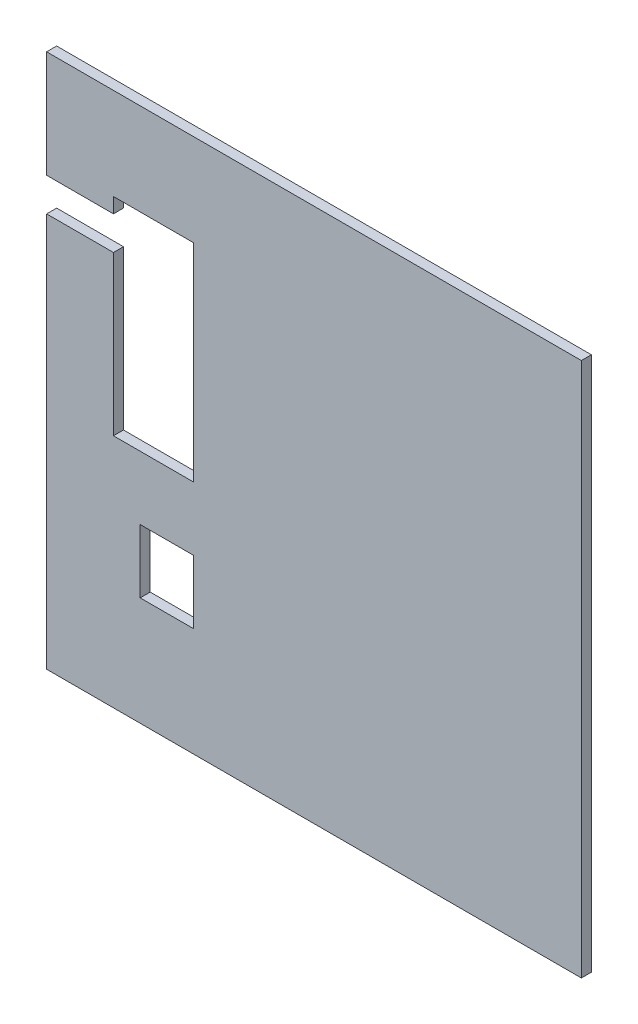
ISO-10303-21;
HEADER;
FILE_DESCRIPTION(('STEP AP214'),'2;1');
FILE_NAME('part.step','',(''),(''),'','','');
FILE_SCHEMA(('AUTOMOTIVE_DESIGN { 1 0 10303 214 1 1 1 1 }'));
ENDSEC;
DATA;
#1=APPLICATION_CONTEXT('core data for automotive mechanical design processes');
#2=APPLICATION_PROTOCOL_DEFINITION('international standard','automotive_design',2000,#1);
#3=PRODUCT_CONTEXT('',#1,'mechanical');
#4=PRODUCT('Part','Part','',(#3));
#5=PRODUCT_RELATED_PRODUCT_CATEGORY('part','',(#4));
#6=PRODUCT_DEFINITION_FORMATION('','',#4);
#7=PRODUCT_DEFINITION_CONTEXT('part definition',#1,'design');
#8=PRODUCT_DEFINITION('design','',#6,#7);
#9=PRODUCT_DEFINITION_SHAPE('','',#8);
#10=(LENGTH_UNIT() NAMED_UNIT(*) SI_UNIT(.MILLI.,.METRE.));
#11=(NAMED_UNIT(*) PLANE_ANGLE_UNIT() SI_UNIT($,.RADIAN.));
#12=(NAMED_UNIT(*) SI_UNIT($,.STERADIAN.) SOLID_ANGLE_UNIT());
#13=UNCERTAINTY_MEASURE_WITH_UNIT(LENGTH_MEASURE(1.E-05),#10,'distance_accuracy_value','');
#14=(GEOMETRIC_REPRESENTATION_CONTEXT(3) GLOBAL_UNCERTAINTY_ASSIGNED_CONTEXT((#13)) GLOBAL_UNIT_ASSIGNED_CONTEXT((#10,
#11,#12)) REPRESENTATION_CONTEXT('',''));
#15=CARTESIAN_POINT('',(0.,0.,0.));
#16=DIRECTION('',(0.,0.,1.));
#17=DIRECTION('',(1.,0.,0.));
#18=AXIS2_PLACEMENT_3D('',#15,#16,#17);
#19=CARTESIAN_POINT('',(0.,0.,3.));
#20=DIRECTION('',(0.,0.,1.));
#21=DIRECTION('',(1.,0.,0.));
#22=AXIS2_PLACEMENT_3D('',#19,#20,#21);
#23=PLANE('',#22);
#24=DIRECTION('',(0.,-1.,0.));
#25=VECTOR('',#24,1.);
#26=CARTESIAN_POINT('',(-80.,48.,3.));
#27=LINE('',#26,#25);
#28=CARTESIAN_POINT('',(-80.,80.,3.));
#29=VERTEX_POINT('',#28);
#30=CARTESIAN_POINT('',(-80.,48.,3.));
#31=VERTEX_POINT('',#30);
#32=EDGE_CURVE('E182',#29,#31,#27,.T.);
#33=ORIENTED_EDGE('',*,*,#32,.T.);
#34=DIRECTION('',(1.,0.,0.));
#35=VECTOR('',#34,1.);
#36=CARTESIAN_POINT('',(-80.,48.,3.));
#37=LINE('',#36,#35);
#38=CARTESIAN_POINT('',(-60.,48.,3.));
#39=VERTEX_POINT('',#38);
#40=EDGE_CURVE('E185',#31,#39,#37,.T.);
#41=ORIENTED_EDGE('',*,*,#40,.T.);
#42=DIRECTION('',(0.,1.,0.));
#43=VECTOR('',#42,1.);
#44=CARTESIAN_POINT('',(-60.,48.,3.));
#45=LINE('',#44,#43);
#46=CARTESIAN_POINT('',(-60.,52.5,3.));
#47=VERTEX_POINT('',#46);
#48=EDGE_CURVE('E188',#39,#47,#45,.T.);
#49=ORIENTED_EDGE('',*,*,#48,.T.);
#50=DIRECTION('',(1.,0.,0.));
#51=VECTOR('',#50,1.);
#52=CARTESIAN_POINT('',(-60.,52.5,3.));
#53=LINE('',#52,#51);
#54=CARTESIAN_POINT('',(-36.,52.5,3.));
#55=VERTEX_POINT('',#54);
#56=EDGE_CURVE('E190',#47,#55,#53,.T.);
#57=ORIENTED_EDGE('',*,*,#56,.T.);
#58=DIRECTION('',(0.,-1.,0.));
#59=VECTOR('',#58,1.);
#60=CARTESIAN_POINT('',(-36.,52.5,3.));
#61=LINE('',#60,#59);
#62=CARTESIAN_POINT('',(-36.,-9.49999999999999,3.));
#63=VERTEX_POINT('',#62);
#64=EDGE_CURVE('E192',#55,#63,#61,.T.);
#65=ORIENTED_EDGE('',*,*,#64,.T.);
#66=DIRECTION('',(-1.,0.,0.));
#67=VECTOR('',#66,1.);
#68=CARTESIAN_POINT('',(-36.,-9.49999999999999,3.));
#69=LINE('',#68,#67);
#70=CARTESIAN_POINT('',(-60.,-9.49999999999999,3.));
#71=VERTEX_POINT('',#70);
#72=EDGE_CURVE('E194',#63,#71,#69,.T.);
#73=ORIENTED_EDGE('',*,*,#72,.T.);
#74=DIRECTION('',(0.,1.,0.));
#75=VECTOR('',#74,1.);
#76=CARTESIAN_POINT('',(-60.,-9.49999999999999,3.));
#77=LINE('',#76,#75);
#78=CARTESIAN_POINT('',(-60.,38.,3.));
#79=VERTEX_POINT('',#78);
#80=EDGE_CURVE('E196',#71,#79,#77,.T.);
#81=ORIENTED_EDGE('',*,*,#80,.T.);
#82=DIRECTION('',(-1.,0.,0.));
#83=VECTOR('',#82,1.);
#84=CARTESIAN_POINT('',(-60.,38.,3.));
#85=LINE('',#84,#83);
#86=CARTESIAN_POINT('',(-80.,38.,3.));
#87=VERTEX_POINT('',#86);
#88=EDGE_CURVE('E198',#79,#87,#85,.T.);
#89=ORIENTED_EDGE('',*,*,#88,.T.);
#90=DIRECTION('',(0.,-1.,0.));
#91=VECTOR('',#90,1.);
#92=CARTESIAN_POINT('',(-80.,-80.,3.));
#93=LINE('',#92,#91);
#94=CARTESIAN_POINT('',(-80.,-80.,3.));
#95=VERTEX_POINT('',#94);
#96=EDGE_CURVE('E200',#87,#95,#93,.T.);
#97=ORIENTED_EDGE('',*,*,#96,.T.);
#98=DIRECTION('',(1.,0.,0.));
#99=VECTOR('',#98,1.);
#100=CARTESIAN_POINT('',(80.,-80.,3.));
#101=LINE('',#100,#99);
#102=CARTESIAN_POINT('',(80.,-80.,3.));
#103=VERTEX_POINT('',#102);
#104=EDGE_CURVE('E202',#95,#103,#101,.T.);
#105=ORIENTED_EDGE('',*,*,#104,.T.);
#106=DIRECTION('',(0.,1.,0.));
#107=VECTOR('',#106,1.);
#108=CARTESIAN_POINT('',(80.,-80.,3.));
#109=LINE('',#108,#107);
#110=CARTESIAN_POINT('',(80.,80.,3.));
#111=VERTEX_POINT('',#110);
#112=EDGE_CURVE('E204',#103,#111,#109,.T.);
#113=ORIENTED_EDGE('',*,*,#112,.T.);
#114=DIRECTION('',(-1.,0.,0.));
#115=VECTOR('',#114,1.);
#116=CARTESIAN_POINT('',(80.,80.,3.));
#117=LINE('',#116,#115);
#118=EDGE_CURVE('E206',#111,#29,#117,.T.);
#119=ORIENTED_EDGE('',*,*,#118,.T.);
#120=EDGE_LOOP('',(#33,#41,#49,#57,#65,#73,#81,#89,#97,#105,#113,#119));
#121=FACE_BOUND('',#120,.T.);
#122=DIRECTION('',(1.,0.,0.));
#123=VECTOR('',#122,1.);
#124=CARTESIAN_POINT('',(-52.,-47.5,3.));
#125=LINE('',#124,#123);
#126=CARTESIAN_POINT('',(-52.,-47.5,3.));
#127=VERTEX_POINT('',#126);
#128=CARTESIAN_POINT('',(-36.,-47.5,3.));
#129=VERTEX_POINT('',#128);
#130=EDGE_CURVE('E154',#127,#129,#125,.T.);
#131=ORIENTED_EDGE('',*,*,#130,.F.);
#132=DIRECTION('',(0.,-1.,0.));
#133=VECTOR('',#132,1.);
#134=CARTESIAN_POINT('',(-52.,-28.5,3.));
#135=LINE('',#134,#133);
#136=CARTESIAN_POINT('',(-52.,-28.5,3.));
#137=VERTEX_POINT('',#136);
#138=EDGE_CURVE('E146',#137,#127,#135,.T.);
#139=ORIENTED_EDGE('',*,*,#138,.F.);
#140=DIRECTION('',(-1.,0.,0.));
#141=VECTOR('',#140,1.);
#142=CARTESIAN_POINT('',(-52.,-28.5,3.));
#143=LINE('',#142,#141);
#144=CARTESIAN_POINT('',(-36.,-28.5,3.));
#145=VERTEX_POINT('',#144);
#146=EDGE_CURVE('E168',#145,#137,#143,.T.);
#147=ORIENTED_EDGE('',*,*,#146,.F.);
#148=DIRECTION('',(0.,1.,0.));
#149=VECTOR('',#148,1.);
#150=CARTESIAN_POINT('',(-36.,-28.5,3.));
#151=LINE('',#150,#149);
#152=EDGE_CURVE('E166',#129,#145,#151,.T.);
#153=ORIENTED_EDGE('',*,*,#152,.F.);
#154=EDGE_LOOP('',(#131,#139,#147,#153));
#155=FACE_BOUND('',#154,.T.);
#156=ADVANCED_FACE('F33',(#121,#155),#23,.T.);
#157=CARTESIAN_POINT('',(0.,0.,0.));
#158=DIRECTION('',(0.,0.,1.));
#159=DIRECTION('',(1.,0.,0.));
#160=AXIS2_PLACEMENT_3D('',#157,#158,#159);
#161=PLANE('',#160);
#162=DIRECTION('',(0.,-1.,0.));
#163=VECTOR('',#162,1.);
#164=CARTESIAN_POINT('',(-80.,48.,0.));
#165=LINE('',#164,#163);
#166=CARTESIAN_POINT('',(-80.,80.,0.));
#167=VERTEX_POINT('',#166);
#168=CARTESIAN_POINT('',(-80.,48.,0.));
#169=VERTEX_POINT('',#168);
#170=EDGE_CURVE('E162',#167,#169,#165,.T.);
#171=ORIENTED_EDGE('',*,*,#170,.F.);
#172=DIRECTION('',(-1.,0.,0.));
#173=VECTOR('',#172,1.);
#174=CARTESIAN_POINT('',(80.,80.,0.));
#175=LINE('',#174,#173);
#176=CARTESIAN_POINT('',(80.,80.,0.));
#177=VERTEX_POINT('',#176);
#178=EDGE_CURVE('E186',#177,#167,#175,.T.);
#179=ORIENTED_EDGE('',*,*,#178,.F.);
#180=DIRECTION('',(0.,1.,0.));
#181=VECTOR('',#180,1.);
#182=CARTESIAN_POINT('',(80.,-80.,0.));
#183=LINE('',#182,#181);
#184=CARTESIAN_POINT('',(80.,-80.,0.));
#185=VERTEX_POINT('',#184);
#186=EDGE_CURVE('E229',#185,#177,#183,.T.);
#187=ORIENTED_EDGE('',*,*,#186,.F.);
#188=DIRECTION('',(1.,0.,0.));
#189=VECTOR('',#188,1.);
#190=CARTESIAN_POINT('',(80.,-80.,0.));
#191=LINE('',#190,#189);
#192=CARTESIAN_POINT('',(-80.,-80.,0.));
#193=VERTEX_POINT('',#192);
#194=EDGE_CURVE('E227',#193,#185,#191,.T.);
#195=ORIENTED_EDGE('',*,*,#194,.F.);
#196=DIRECTION('',(0.,-1.,0.));
#197=VECTOR('',#196,1.);
#198=CARTESIAN_POINT('',(-80.,-80.,0.));
#199=LINE('',#198,#197);
#200=CARTESIAN_POINT('',(-80.,38.,0.));
#201=VERTEX_POINT('',#200);
#202=EDGE_CURVE('E225',#201,#193,#199,.T.);
#203=ORIENTED_EDGE('',*,*,#202,.F.);
#204=DIRECTION('',(-1.,0.,0.));
#205=VECTOR('',#204,1.);
#206=CARTESIAN_POINT('',(-60.,38.,0.));
#207=LINE('',#206,#205);
#208=CARTESIAN_POINT('',(-60.,38.,0.));
#209=VERTEX_POINT('',#208);
#210=EDGE_CURVE('E223',#209,#201,#207,.T.);
#211=ORIENTED_EDGE('',*,*,#210,.F.);
#212=DIRECTION('',(0.,1.,0.));
#213=VECTOR('',#212,1.);
#214=CARTESIAN_POINT('',(-60.,-9.49999999999999,0.));
#215=LINE('',#214,#213);
#216=CARTESIAN_POINT('',(-60.,-9.49999999999999,0.));
#217=VERTEX_POINT('',#216);
#218=EDGE_CURVE('E221',#217,#209,#215,.T.);
#219=ORIENTED_EDGE('',*,*,#218,.F.);
#220=DIRECTION('',(-1.,0.,0.));
#221=VECTOR('',#220,1.);
#222=CARTESIAN_POINT('',(-36.,-9.49999999999999,0.));
#223=LINE('',#222,#221);
#224=CARTESIAN_POINT('',(-36.,-9.49999999999999,0.));
#225=VERTEX_POINT('',#224);
#226=EDGE_CURVE('E219',#225,#217,#223,.T.);
#227=ORIENTED_EDGE('',*,*,#226,.F.);
#228=DIRECTION('',(0.,-1.,0.));
#229=VECTOR('',#228,1.);
#230=CARTESIAN_POINT('',(-36.,52.5,0.));
#231=LINE('',#230,#229);
#232=CARTESIAN_POINT('',(-36.,52.5,0.));
#233=VERTEX_POINT('',#232);
#234=EDGE_CURVE('E217',#233,#225,#231,.T.);
#235=ORIENTED_EDGE('',*,*,#234,.F.);
#236=DIRECTION('',(1.,0.,0.));
#237=VECTOR('',#236,1.);
#238=CARTESIAN_POINT('',(-60.,52.5,0.));
#239=LINE('',#238,#237);
#240=CARTESIAN_POINT('',(-60.,52.5,0.));
#241=VERTEX_POINT('',#240);
#242=EDGE_CURVE('E215',#241,#233,#239,.T.);
#243=ORIENTED_EDGE('',*,*,#242,.F.);
#244=DIRECTION('',(0.,1.,0.));
#245=VECTOR('',#244,1.);
#246=CARTESIAN_POINT('',(-60.,48.,0.));
#247=LINE('',#246,#245);
#248=CARTESIAN_POINT('',(-60.,48.,0.));
#249=VERTEX_POINT('',#248);
#250=EDGE_CURVE('E213',#249,#241,#247,.T.);
#251=ORIENTED_EDGE('',*,*,#250,.F.);
#252=DIRECTION('',(1.,0.,0.));
#253=VECTOR('',#252,1.);
#254=CARTESIAN_POINT('',(-80.,48.,0.));
#255=LINE('',#254,#253);
#256=EDGE_CURVE('E211',#169,#249,#255,.T.);
#257=ORIENTED_EDGE('',*,*,#256,.F.);
#258=EDGE_LOOP('',(#171,#179,#187,#195,#203,#211,#219,#227,#235,#243,#251,#257));
#259=FACE_BOUND('',#258,.T.);
#260=DIRECTION('',(0.,-1.,0.));
#261=VECTOR('',#260,1.);
#262=CARTESIAN_POINT('',(-52.,-28.5,0.));
#263=LINE('',#262,#261);
#264=CARTESIAN_POINT('',(-52.,-28.5,0.));
#265=VERTEX_POINT('',#264);
#266=CARTESIAN_POINT('',(-52.,-47.5,0.));
#267=VERTEX_POINT('',#266);
#268=EDGE_CURVE('E56',#265,#267,#263,.T.);
#269=ORIENTED_EDGE('',*,*,#268,.T.);
#270=DIRECTION('',(1.,0.,0.));
#271=VECTOR('',#270,1.);
#272=CARTESIAN_POINT('',(-52.,-47.5,0.));
#273=LINE('',#272,#271);
#274=CARTESIAN_POINT('',(-36.,-47.5,0.));
#275=VERTEX_POINT('',#274);
#276=EDGE_CURVE('E161',#267,#275,#273,.T.);
#277=ORIENTED_EDGE('',*,*,#276,.T.);
#278=DIRECTION('',(0.,1.,0.));
#279=VECTOR('',#278,1.);
#280=CARTESIAN_POINT('',(-36.,-28.5,0.));
#281=LINE('',#280,#279);
#282=CARTESIAN_POINT('',(-36.,-28.5,0.));
#283=VERTEX_POINT('',#282);
#284=EDGE_CURVE('E174',#275,#283,#281,.T.);
#285=ORIENTED_EDGE('',*,*,#284,.T.);
#286=DIRECTION('',(-1.,0.,0.));
#287=VECTOR('',#286,1.);
#288=CARTESIAN_POINT('',(-52.,-28.5,0.));
#289=LINE('',#288,#287);
#290=EDGE_CURVE('E155',#283,#265,#289,.T.);
#291=ORIENTED_EDGE('',*,*,#290,.T.);
#292=EDGE_LOOP('',(#269,#277,#285,#291));
#293=FACE_BOUND('',#292,.T.);
#294=ADVANCED_FACE('F271',(#259,#293),#161,.F.);
#295=CARTESIAN_POINT('',(-80.,48.,3.));
#296=DIRECTION('',(1.,0.,0.));
#297=DIRECTION('',(0.,0.,-1.));
#298=AXIS2_PLACEMENT_3D('',#295,#296,#297);
#299=PLANE('',#298);
#300=ORIENTED_EDGE('',*,*,#170,.T.);
#301=DIRECTION('',(0.,0.,-1.));
#302=VECTOR('',#301,1.);
#303=CARTESIAN_POINT('',(-80.,48.,3.));
#304=LINE('',#303,#302);
#305=EDGE_CURVE('E11',#31,#169,#304,.T.);
#306=ORIENTED_EDGE('',*,*,#305,.F.);
#307=ORIENTED_EDGE('',*,*,#32,.F.);
#308=DIRECTION('',(0.,0.,-1.));
#309=VECTOR('',#308,1.);
#310=CARTESIAN_POINT('',(-80.,80.,3.));
#311=LINE('',#310,#309);
#312=EDGE_CURVE('E208',#29,#167,#311,.T.);
#313=ORIENTED_EDGE('',*,*,#312,.T.);
#314=EDGE_LOOP('',(#300,#306,#307,#313));
#315=FACE_BOUND('',#314,.T.);
#316=ADVANCED_FACE('F35',(#315),#299,.F.);
#317=CARTESIAN_POINT('',(-80.,48.,3.));
#318=DIRECTION('',(0.,1.,0.));
#319=DIRECTION('',(0.,0.,1.));
#320=AXIS2_PLACEMENT_3D('',#317,#318,#319);
#321=PLANE('',#320);
#322=ORIENTED_EDGE('',*,*,#256,.T.);
#323=DIRECTION('',(0.,0.,-1.));
#324=VECTOR('',#323,1.);
#325=CARTESIAN_POINT('',(-60.,48.,3.));
#326=LINE('',#325,#324);
#327=EDGE_CURVE('E41',#39,#249,#326,.T.);
#328=ORIENTED_EDGE('',*,*,#327,.F.);
#329=ORIENTED_EDGE('',*,*,#40,.F.);
#330=ORIENTED_EDGE('',*,*,#305,.T.);
#331=EDGE_LOOP('',(#322,#328,#329,#330));
#332=FACE_BOUND('',#331,.T.);
#333=ADVANCED_FACE('F288',(#332),#321,.F.);
#334=CARTESIAN_POINT('',(-60.,48.,3.));
#335=DIRECTION('',(-1.,0.,0.));
#336=DIRECTION('',(0.,0.,1.));
#337=AXIS2_PLACEMENT_3D('',#334,#335,#336);
#338=PLANE('',#337);
#339=ORIENTED_EDGE('',*,*,#250,.T.);
#340=DIRECTION('',(0.,0.,-1.));
#341=VECTOR('',#340,1.);
#342=CARTESIAN_POINT('',(-60.,52.5,3.));
#343=LINE('',#342,#341);
#344=EDGE_CURVE('E258',#47,#241,#343,.T.);
#345=ORIENTED_EDGE('',*,*,#344,.F.);
#346=ORIENTED_EDGE('',*,*,#48,.F.);
#347=ORIENTED_EDGE('',*,*,#327,.T.);
#348=EDGE_LOOP('',(#339,#345,#346,#347));
#349=FACE_BOUND('',#348,.T.);
#350=ADVANCED_FACE('F265',(#349),#338,.F.);
#351=CARTESIAN_POINT('',(-60.,52.5,3.));
#352=DIRECTION('',(0.,1.,0.));
#353=DIRECTION('',(0.,0.,1.));
#354=AXIS2_PLACEMENT_3D('',#351,#352,#353);
#355=PLANE('',#354);
#356=ORIENTED_EDGE('',*,*,#242,.T.);
#357=DIRECTION('',(0.,0.,-1.));
#358=VECTOR('',#357,1.);
#359=CARTESIAN_POINT('',(-36.,52.5,3.));
#360=LINE('',#359,#358);
#361=EDGE_CURVE('E255',#55,#233,#360,.T.);
#362=ORIENTED_EDGE('',*,*,#361,.F.);
#363=ORIENTED_EDGE('',*,*,#56,.F.);
#364=ORIENTED_EDGE('',*,*,#344,.T.);
#365=EDGE_LOOP('',(#356,#362,#363,#364));
#366=FACE_BOUND('',#365,.T.);
#367=ADVANCED_FACE('F277',(#366),#355,.F.);
#368=CARTESIAN_POINT('',(-36.,52.5,3.));
#369=DIRECTION('',(1.,0.,0.));
#370=DIRECTION('',(0.,1.,0.));
#371=AXIS2_PLACEMENT_3D('',#368,#369,#370);
#372=PLANE('',#371);
#373=ORIENTED_EDGE('',*,*,#234,.T.);
#374=DIRECTION('',(0.,0.,-1.));
#375=VECTOR('',#374,1.);
#376=CARTESIAN_POINT('',(-36.,-9.49999999999999,3.));
#377=LINE('',#376,#375);
#378=EDGE_CURVE('E252',#63,#225,#377,.T.);
#379=ORIENTED_EDGE('',*,*,#378,.F.);
#380=ORIENTED_EDGE('',*,*,#64,.F.);
#381=ORIENTED_EDGE('',*,*,#361,.T.);
#382=EDGE_LOOP('',(#373,#379,#380,#381));
#383=FACE_BOUND('',#382,.T.);
#384=ADVANCED_FACE('F281',(#383),#372,.F.);
#385=CARTESIAN_POINT('',(-36.,-9.49999999999999,3.));
#386=DIRECTION('',(0.,-1.,0.));
#387=DIRECTION('',(1.,0.,0.));
#388=AXIS2_PLACEMENT_3D('',#385,#386,#387);
#389=PLANE('',#388);
#390=ORIENTED_EDGE('',*,*,#226,.T.);
#391=DIRECTION('',(0.,0.,-1.));
#392=VECTOR('',#391,1.);
#393=CARTESIAN_POINT('',(-60.,-9.49999999999999,3.));
#394=LINE('',#393,#392);
#395=EDGE_CURVE('E249',#71,#217,#394,.T.);
#396=ORIENTED_EDGE('',*,*,#395,.F.);
#397=ORIENTED_EDGE('',*,*,#72,.F.);
#398=ORIENTED_EDGE('',*,*,#378,.T.);
#399=EDGE_LOOP('',(#390,#396,#397,#398));
#400=FACE_BOUND('',#399,.T.);
#401=ADVANCED_FACE('F321',(#400),#389,.F.);
#402=CARTESIAN_POINT('',(-60.,-9.49999999999999,3.));
#403=DIRECTION('',(-1.,0.,0.));
#404=DIRECTION('',(0.,0.,1.));
#405=AXIS2_PLACEMENT_3D('',#402,#403,#404);
#406=PLANE('',#405);
#407=ORIENTED_EDGE('',*,*,#218,.T.);
#408=DIRECTION('',(0.,0.,-1.));
#409=VECTOR('',#408,1.);
#410=CARTESIAN_POINT('',(-60.,38.,3.));
#411=LINE('',#410,#409);
#412=EDGE_CURVE('E246',#79,#209,#411,.T.);
#413=ORIENTED_EDGE('',*,*,#412,.F.);
#414=ORIENTED_EDGE('',*,*,#80,.F.);
#415=ORIENTED_EDGE('',*,*,#395,.T.);
#416=EDGE_LOOP('',(#407,#413,#414,#415));
#417=FACE_BOUND('',#416,.T.);
#418=ADVANCED_FACE('F319',(#417),#406,.F.);
#419=CARTESIAN_POINT('',(-60.,38.,3.));
#420=DIRECTION('',(0.,-1.,0.));
#421=DIRECTION('',(0.,0.,-1.));
#422=AXIS2_PLACEMENT_3D('',#419,#420,#421);
#423=PLANE('',#422);
#424=ORIENTED_EDGE('',*,*,#210,.T.);
#425=DIRECTION('',(0.,0.,-1.));
#426=VECTOR('',#425,1.);
#427=CARTESIAN_POINT('',(-80.,38.,3.));
#428=LINE('',#427,#426);
#429=EDGE_CURVE('E243',#87,#201,#428,.T.);
#430=ORIENTED_EDGE('',*,*,#429,.F.);
#431=ORIENTED_EDGE('',*,*,#88,.F.);
#432=ORIENTED_EDGE('',*,*,#412,.T.);
#433=EDGE_LOOP('',(#424,#430,#431,#432));
#434=FACE_BOUND('',#433,.T.);
#435=ADVANCED_FACE('F315',(#434),#423,.F.);
#436=CARTESIAN_POINT('',(-80.,-80.,3.));
#437=DIRECTION('',(1.,0.,0.));
#438=DIRECTION('',(0.,0.,-1.));
#439=AXIS2_PLACEMENT_3D('',#436,#437,#438);
#440=PLANE('',#439);
#441=ORIENTED_EDGE('',*,*,#202,.T.);
#442=DIRECTION('',(0.,0.,-1.));
#443=VECTOR('',#442,1.);
#444=CARTESIAN_POINT('',(-80.,-80.,3.));
#445=LINE('',#444,#443);
#446=EDGE_CURVE('E240',#95,#193,#445,.T.);
#447=ORIENTED_EDGE('',*,*,#446,.F.);
#448=ORIENTED_EDGE('',*,*,#96,.F.);
#449=ORIENTED_EDGE('',*,*,#429,.T.);
#450=EDGE_LOOP('',(#441,#447,#448,#449));
#451=FACE_BOUND('',#450,.T.);
#452=ADVANCED_FACE('F310',(#451),#440,.F.);
#453=CARTESIAN_POINT('',(80.,-80.,3.));
#454=DIRECTION('',(0.,1.,0.));
#455=DIRECTION('',(-1.,0.,0.));
#456=AXIS2_PLACEMENT_3D('',#453,#454,#455);
#457=PLANE('',#456);
#458=ORIENTED_EDGE('',*,*,#194,.T.);
#459=DIRECTION('',(0.,0.,-1.));
#460=VECTOR('',#459,1.);
#461=CARTESIAN_POINT('',(80.,-80.,3.));
#462=LINE('',#461,#460);
#463=EDGE_CURVE('E237',#103,#185,#462,.T.);
#464=ORIENTED_EDGE('',*,*,#463,.F.);
#465=ORIENTED_EDGE('',*,*,#104,.F.);
#466=ORIENTED_EDGE('',*,*,#446,.T.);
#467=EDGE_LOOP('',(#458,#464,#465,#466));
#468=FACE_BOUND('',#467,.T.);
#469=ADVANCED_FACE('F304',(#468),#457,.F.);
#470=CARTESIAN_POINT('',(80.,-80.,3.));
#471=DIRECTION('',(-1.,0.,0.));
#472=DIRECTION('',(0.,0.,1.));
#473=AXIS2_PLACEMENT_3D('',#470,#471,#472);
#474=PLANE('',#473);
#475=ORIENTED_EDGE('',*,*,#186,.T.);
#476=DIRECTION('',(0.,0.,-1.));
#477=VECTOR('',#476,1.);
#478=CARTESIAN_POINT('',(80.,80.,3.));
#479=LINE('',#478,#477);
#480=EDGE_CURVE('E234',#111,#177,#479,.T.);
#481=ORIENTED_EDGE('',*,*,#480,.F.);
#482=ORIENTED_EDGE('',*,*,#112,.F.);
#483=ORIENTED_EDGE('',*,*,#463,.T.);
#484=EDGE_LOOP('',(#475,#481,#482,#483));
#485=FACE_BOUND('',#484,.T.);
#486=ADVANCED_FACE('F300',(#485),#474,.F.);
#487=CARTESIAN_POINT('',(80.,80.,3.));
#488=DIRECTION('',(0.,-1.,0.));
#489=DIRECTION('',(1.,0.,0.));
#490=AXIS2_PLACEMENT_3D('',#487,#488,#489);
#491=PLANE('',#490);
#492=ORIENTED_EDGE('',*,*,#178,.T.);
#493=ORIENTED_EDGE('',*,*,#312,.F.);
#494=ORIENTED_EDGE('',*,*,#118,.F.);
#495=ORIENTED_EDGE('',*,*,#480,.T.);
#496=EDGE_LOOP('',(#492,#493,#494,#495));
#497=FACE_BOUND('',#496,.T.);
#498=ADVANCED_FACE('F295',(#497),#491,.F.);
#499=CARTESIAN_POINT('',(-52.,-28.5,3.));
#500=DIRECTION('',(1.,0.,0.));
#501=DIRECTION('',(0.,0.,-1.));
#502=AXIS2_PLACEMENT_3D('',#499,#500,#501);
#503=PLANE('',#502);
#504=ORIENTED_EDGE('',*,*,#268,.F.);
#505=DIRECTION('',(0.,0.,-1.));
#506=VECTOR('',#505,1.);
#507=CARTESIAN_POINT('',(-52.,-28.5,3.));
#508=LINE('',#507,#506);
#509=EDGE_CURVE('E150',#137,#265,#508,.T.);
#510=ORIENTED_EDGE('',*,*,#509,.F.);
#511=ORIENTED_EDGE('',*,*,#138,.T.);
#512=DIRECTION('',(0.,0.,-1.));
#513=VECTOR('',#512,1.);
#514=CARTESIAN_POINT('',(-52.,-47.5,3.));
#515=LINE('',#514,#513);
#516=EDGE_CURVE('E149',#127,#267,#515,.T.);
#517=ORIENTED_EDGE('',*,*,#516,.T.);
#518=EDGE_LOOP('',(#504,#510,#511,#517));
#519=FACE_BOUND('',#518,.T.);
#520=ADVANCED_FACE('F148',(#519),#503,.T.);
#521=CARTESIAN_POINT('',(-52.,-47.5,3.));
#522=DIRECTION('',(0.,1.,0.));
#523=DIRECTION('',(0.,0.,1.));
#524=AXIS2_PLACEMENT_3D('',#521,#522,#523);
#525=PLANE('',#524);
#526=ORIENTED_EDGE('',*,*,#276,.F.);
#527=ORIENTED_EDGE('',*,*,#516,.F.);
#528=ORIENTED_EDGE('',*,*,#130,.T.);
#529=DIRECTION('',(0.,0.,-1.));
#530=VECTOR('',#529,1.);
#531=CARTESIAN_POINT('',(-36.,-47.5,3.));
#532=LINE('',#531,#530);
#533=EDGE_CURVE('E163',#129,#275,#532,.T.);
#534=ORIENTED_EDGE('',*,*,#533,.T.);
#535=EDGE_LOOP('',(#526,#527,#528,#534));
#536=FACE_BOUND('',#535,.T.);
#537=ADVANCED_FACE('F158',(#536),#525,.T.);
#538=CARTESIAN_POINT('',(-36.,-28.5,3.));
#539=DIRECTION('',(-1.,0.,0.));
#540=DIRECTION('',(0.,-1.,0.));
#541=AXIS2_PLACEMENT_3D('',#538,#539,#540);
#542=PLANE('',#541);
#543=ORIENTED_EDGE('',*,*,#284,.F.);
#544=ORIENTED_EDGE('',*,*,#533,.F.);
#545=ORIENTED_EDGE('',*,*,#152,.T.);
#546=DIRECTION('',(0.,0.,-1.));
#547=VECTOR('',#546,1.);
#548=CARTESIAN_POINT('',(-36.,-28.5,3.));
#549=LINE('',#548,#547);
#550=EDGE_CURVE('E48',#145,#283,#549,.T.);
#551=ORIENTED_EDGE('',*,*,#550,.T.);
#552=EDGE_LOOP('',(#543,#544,#545,#551));
#553=FACE_BOUND('',#552,.T.);
#554=ADVANCED_FACE('F379',(#553),#542,.T.);
#555=CARTESIAN_POINT('',(-52.,-28.5,3.));
#556=DIRECTION('',(0.,-1.,0.));
#557=DIRECTION('',(0.,0.,-1.));
#558=AXIS2_PLACEMENT_3D('',#555,#556,#557);
#559=PLANE('',#558);
#560=ORIENTED_EDGE('',*,*,#290,.F.);
#561=ORIENTED_EDGE('',*,*,#550,.F.);
#562=ORIENTED_EDGE('',*,*,#146,.T.);
#563=ORIENTED_EDGE('',*,*,#509,.T.);
#564=EDGE_LOOP('',(#560,#561,#562,#563));
#565=FACE_BOUND('',#564,.T.);
#566=ADVANCED_FACE('F385',(#565),#559,.T.);
#567=CLOSED_SHELL('',(#156,#294,#316,#333,#350,#367,#384,#401,#418,#435,#452,#469,#486,#498,
#520,#537,#554,#566));
#568=MANIFOLD_SOLID_BREP('B2',#567);
#569=ADVANCED_BREP_SHAPE_REPRESENTATION('',(#18,#568),#14);
#570=SHAPE_DEFINITION_REPRESENTATION(#9,#569);
ENDSEC;
END-ISO-10303-21;
